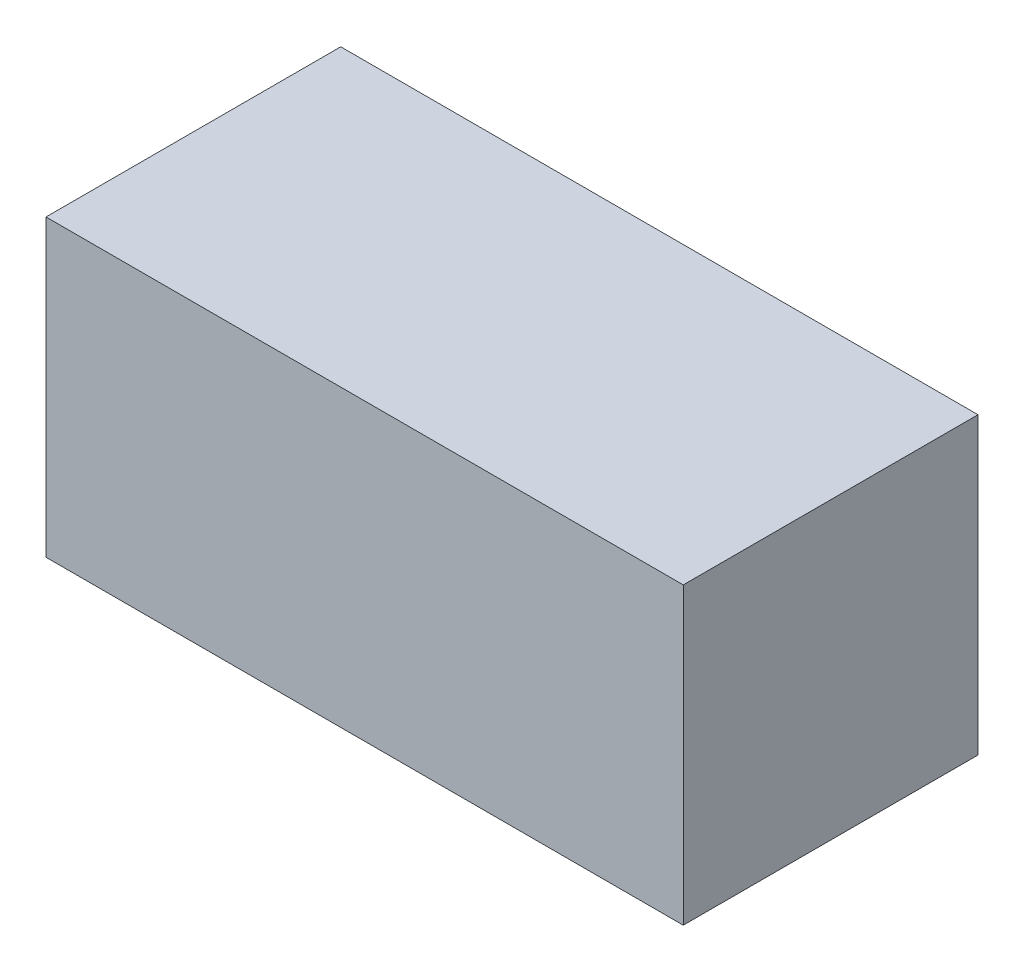
ISO-10303-21;
HEADER;
FILE_DESCRIPTION(('STEP AP214'),'2;1');
FILE_NAME('part.step','',(''),(''),'','','');
FILE_SCHEMA(('AUTOMOTIVE_DESIGN { 1 0 10303 214 1 1 1 1 }'));
ENDSEC;
DATA;
#1=APPLICATION_CONTEXT('core data for automotive mechanical design processes');
#2=APPLICATION_PROTOCOL_DEFINITION('international standard','automotive_design',2000,#1);
#3=PRODUCT_CONTEXT('',#1,'mechanical');
#4=PRODUCT('Part','Part','',(#3));
#5=PRODUCT_RELATED_PRODUCT_CATEGORY('part','',(#4));
#6=PRODUCT_DEFINITION_FORMATION('','',#4);
#7=PRODUCT_DEFINITION_CONTEXT('part definition',#1,'design');
#8=PRODUCT_DEFINITION('design','',#6,#7);
#9=PRODUCT_DEFINITION_SHAPE('','',#8);
#10=(LENGTH_UNIT() NAMED_UNIT(*) SI_UNIT(.MILLI.,.METRE.));
#11=(NAMED_UNIT(*) PLANE_ANGLE_UNIT() SI_UNIT($,.RADIAN.));
#12=(NAMED_UNIT(*) SI_UNIT($,.STERADIAN.) SOLID_ANGLE_UNIT());
#13=UNCERTAINTY_MEASURE_WITH_UNIT(LENGTH_MEASURE(1.E-05),#10,'distance_accuracy_value','');
#14=(GEOMETRIC_REPRESENTATION_CONTEXT(3) GLOBAL_UNCERTAINTY_ASSIGNED_CONTEXT((#13)) GLOBAL_UNIT_ASSIGNED_CONTEXT((#10,
#11,#12)) REPRESENTATION_CONTEXT('',''));
#15=CARTESIAN_POINT('',(0.,0.,0.));
#16=DIRECTION('',(0.,0.,1.));
#17=DIRECTION('',(1.,0.,0.));
#18=AXIS2_PLACEMENT_3D('',#15,#16,#17);
#19=CARTESIAN_POINT('',(48.,-18.5,-18.5));
#20=DIRECTION('',(-1.,0.,0.));
#21=DIRECTION('',(0.,0.,1.));
#22=AXIS2_PLACEMENT_3D('',#19,#20,#21);
#23=PLANE('',#22);
#24=DIRECTION('',(0.,-1.,0.));
#25=VECTOR('',#24,1.);
#26=CARTESIAN_POINT('',(48.,-18.5,18.5));
#27=LINE('',#26,#25);
#28=CARTESIAN_POINT('',(48.,18.5,18.5));
#29=VERTEX_POINT('',#28);
#30=CARTESIAN_POINT('',(48.,-18.5,18.5));
#31=VERTEX_POINT('',#30);
#32=EDGE_CURVE('E103',#29,#31,#27,.T.);
#33=ORIENTED_EDGE('',*,*,#32,.F.);
#34=DIRECTION('',(0.,0.,1.));
#35=VECTOR('',#34,1.);
#36=CARTESIAN_POINT('',(48.,18.5,-18.5));
#37=LINE('',#36,#35);
#38=CARTESIAN_POINT('',(48.,18.5,-18.5));
#39=VERTEX_POINT('',#38);
#40=EDGE_CURVE('E11',#39,#29,#37,.T.);
#41=ORIENTED_EDGE('',*,*,#40,.F.);
#42=DIRECTION('',(0.,-1.,0.));
#43=VECTOR('',#42,1.);
#44=CARTESIAN_POINT('',(48.,-18.5,-18.5));
#45=LINE('',#44,#43);
#46=CARTESIAN_POINT('',(48.,-18.5,-18.5));
#47=VERTEX_POINT('',#46);
#48=EDGE_CURVE('E97',#39,#47,#45,.T.);
#49=ORIENTED_EDGE('',*,*,#48,.T.);
#50=DIRECTION('',(0.,0.,1.));
#51=VECTOR('',#50,1.);
#52=CARTESIAN_POINT('',(48.,-18.5,-18.5));
#53=LINE('',#52,#51);
#54=EDGE_CURVE('E42',#47,#31,#53,.T.);
#55=ORIENTED_EDGE('',*,*,#54,.T.);
#56=EDGE_LOOP('',(#33,#41,#49,#55));
#57=FACE_BOUND('',#56,.T.);
#58=ADVANCED_FACE('F39',(#57),#23,.T.);
#59=CARTESIAN_POINT('',(48.,18.5,-18.5));
#60=DIRECTION('',(0.,1.,0.));
#61=DIRECTION('',(0.,0.,1.));
#62=AXIS2_PLACEMENT_3D('',#59,#60,#61);
#63=PLANE('',#62);
#64=DIRECTION('',(-1.,0.,0.));
#65=VECTOR('',#64,1.);
#66=CARTESIAN_POINT('',(48.,18.5,18.5));
#67=LINE('',#66,#65);
#68=CARTESIAN_POINT('',(128.,18.5,18.5));
#69=VERTEX_POINT('',#68);
#70=EDGE_CURVE('E99',#69,#29,#67,.T.);
#71=ORIENTED_EDGE('',*,*,#70,.F.);
#72=DIRECTION('',(0.,0.,1.));
#73=VECTOR('',#72,1.);
#74=CARTESIAN_POINT('',(128.,18.5,-18.5));
#75=LINE('',#74,#73);
#76=CARTESIAN_POINT('',(128.,18.5,-18.5));
#77=VERTEX_POINT('',#76);
#78=EDGE_CURVE('E48',#77,#69,#75,.T.);
#79=ORIENTED_EDGE('',*,*,#78,.F.);
#80=DIRECTION('',(-1.,0.,0.));
#81=VECTOR('',#80,1.);
#82=CARTESIAN_POINT('',(48.,18.5,-18.5));
#83=LINE('',#82,#81);
#84=EDGE_CURVE('E94',#77,#39,#83,.T.);
#85=ORIENTED_EDGE('',*,*,#84,.T.);
#86=ORIENTED_EDGE('',*,*,#40,.T.);
#87=EDGE_LOOP('',(#71,#79,#85,#86));
#88=FACE_BOUND('',#87,.T.);
#89=ADVANCED_FACE('F113',(#88),#63,.T.);
#90=CARTESIAN_POINT('',(128.,-18.5,-18.5));
#91=DIRECTION('',(1.,0.,0.));
#92=DIRECTION('',(0.,0.,-1.));
#93=AXIS2_PLACEMENT_3D('',#90,#91,#92);
#94=PLANE('',#93);
#95=DIRECTION('',(0.,1.,0.));
#96=VECTOR('',#95,1.);
#97=CARTESIAN_POINT('',(128.,-18.5,18.5));
#98=LINE('',#97,#96);
#99=CARTESIAN_POINT('',(128.,-18.5,18.5));
#100=VERTEX_POINT('',#99);
#101=EDGE_CURVE('E89',#100,#69,#98,.T.);
#102=ORIENTED_EDGE('',*,*,#101,.F.);
#103=DIRECTION('',(0.,0.,1.));
#104=VECTOR('',#103,1.);
#105=CARTESIAN_POINT('',(128.,-18.5,-18.5));
#106=LINE('',#105,#104);
#107=CARTESIAN_POINT('',(128.,-18.5,-18.5));
#108=VERTEX_POINT('',#107);
#109=EDGE_CURVE('E84',#108,#100,#106,.T.);
#110=ORIENTED_EDGE('',*,*,#109,.F.);
#111=DIRECTION('',(0.,1.,0.));
#112=VECTOR('',#111,1.);
#113=CARTESIAN_POINT('',(128.,-18.5,-18.5));
#114=LINE('',#113,#112);
#115=EDGE_CURVE('E87',#108,#77,#114,.T.);
#116=ORIENTED_EDGE('',*,*,#115,.T.);
#117=ORIENTED_EDGE('',*,*,#78,.T.);
#118=EDGE_LOOP('',(#102,#110,#116,#117));
#119=FACE_BOUND('',#118,.T.);
#120=ADVANCED_FACE('F86',(#119),#94,.T.);
#121=CARTESIAN_POINT('',(48.,-18.5,-18.5));
#122=DIRECTION('',(0.,-1.,0.));
#123=DIRECTION('',(0.,0.,-1.));
#124=AXIS2_PLACEMENT_3D('',#121,#122,#123);
#125=PLANE('',#124);
#126=DIRECTION('',(1.,0.,0.));
#127=VECTOR('',#126,1.);
#128=CARTESIAN_POINT('',(48.,-18.5,18.5));
#129=LINE('',#128,#127);
#130=EDGE_CURVE('E106',#31,#100,#129,.T.);
#131=ORIENTED_EDGE('',*,*,#130,.F.);
#132=ORIENTED_EDGE('',*,*,#54,.F.);
#133=DIRECTION('',(1.,0.,0.));
#134=VECTOR('',#133,1.);
#135=CARTESIAN_POINT('',(48.,-18.5,-18.5));
#136=LINE('',#135,#134);
#137=EDGE_CURVE('E93',#47,#108,#136,.T.);
#138=ORIENTED_EDGE('',*,*,#137,.T.);
#139=ORIENTED_EDGE('',*,*,#109,.T.);
#140=EDGE_LOOP('',(#131,#132,#138,#139));
#141=FACE_BOUND('',#140,.T.);
#142=ADVANCED_FACE('F96',(#141),#125,.T.);
#143=CARTESIAN_POINT('',(0.,0.,-18.5));
#144=DIRECTION('',(0.,0.,-1.));
#145=DIRECTION('',(-1.,0.,0.));
#146=AXIS2_PLACEMENT_3D('',#143,#144,#145);
#147=PLANE('',#146);
#148=ORIENTED_EDGE('',*,*,#48,.F.);
#149=ORIENTED_EDGE('',*,*,#84,.F.);
#150=ORIENTED_EDGE('',*,*,#115,.F.);
#151=ORIENTED_EDGE('',*,*,#137,.F.);
#152=EDGE_LOOP('',(#148,#149,#150,#151));
#153=FACE_BOUND('',#152,.T.);
#154=ADVANCED_FACE('F92',(#153),#147,.T.);
#155=CARTESIAN_POINT('',(0.,0.,18.5));
#156=DIRECTION('',(0.,0.,-1.));
#157=DIRECTION('',(-1.,0.,0.));
#158=AXIS2_PLACEMENT_3D('',#155,#156,#157);
#159=PLANE('',#158);
#160=ORIENTED_EDGE('',*,*,#32,.T.);
#161=ORIENTED_EDGE('',*,*,#130,.T.);
#162=ORIENTED_EDGE('',*,*,#101,.T.);
#163=ORIENTED_EDGE('',*,*,#70,.T.);
#164=EDGE_LOOP('',(#160,#161,#162,#163));
#165=FACE_BOUND('',#164,.T.);
#166=ADVANCED_FACE('F112',(#165),#159,.F.);
#167=CLOSED_SHELL('',(#58,#89,#120,#142,#154,#166));
#168=MANIFOLD_SOLID_BREP('B2',#167);
#169=ADVANCED_BREP_SHAPE_REPRESENTATION('',(#18,#168),#14);
#170=SHAPE_DEFINITION_REPRESENTATION(#9,#169);
ENDSEC;
END-ISO-10303-21;
